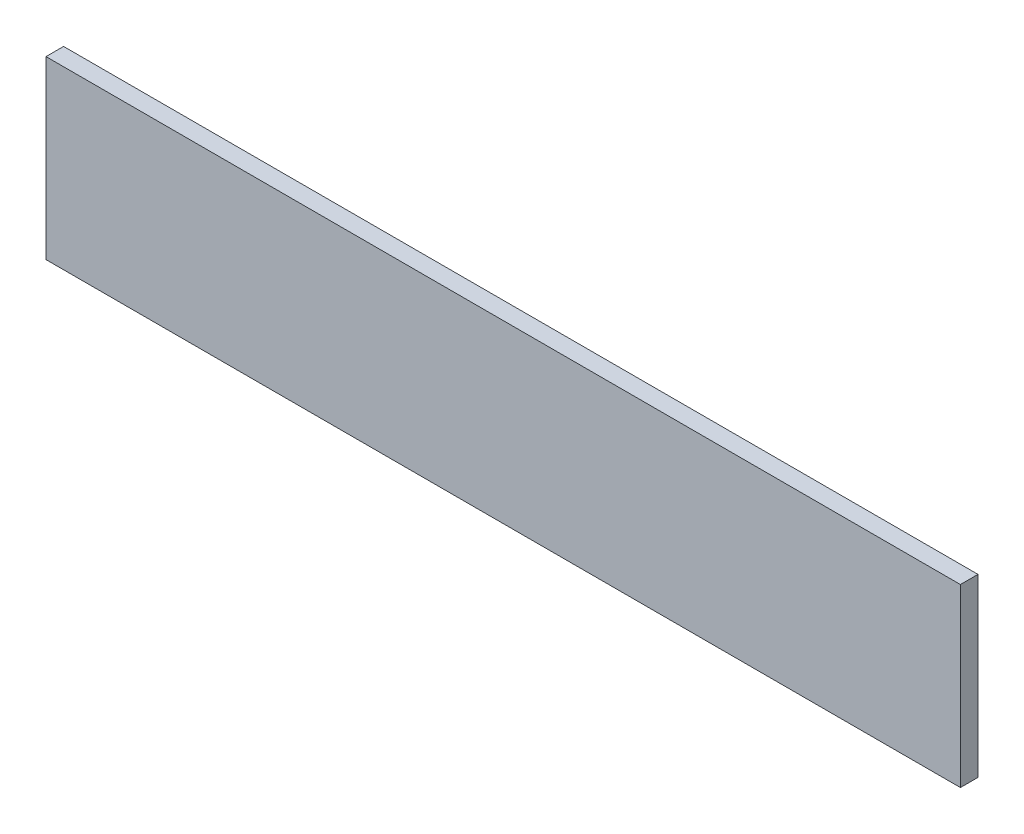
ISO-10303-21;
HEADER;
FILE_DESCRIPTION(('STEP AP214'),'2;1');
FILE_NAME('part.step','',(''),(''),'','','');
FILE_SCHEMA(('AUTOMOTIVE_DESIGN { 1 0 10303 214 1 1 1 1 }'));
ENDSEC;
DATA;
#1=APPLICATION_CONTEXT('core data for automotive mechanical design processes');
#2=APPLICATION_PROTOCOL_DEFINITION('international standard','automotive_design',2000,#1);
#3=PRODUCT_CONTEXT('',#1,'mechanical');
#4=PRODUCT('Part','Part','',(#3));
#5=PRODUCT_RELATED_PRODUCT_CATEGORY('part','',(#4));
#6=PRODUCT_DEFINITION_FORMATION('','',#4);
#7=PRODUCT_DEFINITION_CONTEXT('part definition',#1,'design');
#8=PRODUCT_DEFINITION('design','',#6,#7);
#9=PRODUCT_DEFINITION_SHAPE('','',#8);
#10=(LENGTH_UNIT() NAMED_UNIT(*) SI_UNIT(.MILLI.,.METRE.));
#11=(NAMED_UNIT(*) PLANE_ANGLE_UNIT() SI_UNIT($,.RADIAN.));
#12=(NAMED_UNIT(*) SI_UNIT($,.STERADIAN.) SOLID_ANGLE_UNIT());
#13=UNCERTAINTY_MEASURE_WITH_UNIT(LENGTH_MEASURE(1.E-05),#10,'distance_accuracy_value','');
#14=(GEOMETRIC_REPRESENTATION_CONTEXT(3) GLOBAL_UNCERTAINTY_ASSIGNED_CONTEXT((#13)) GLOBAL_UNIT_ASSIGNED_CONTEXT((#10,
#11,#12)) REPRESENTATION_CONTEXT('',''));
#15=CARTESIAN_POINT('',(0.,0.,0.));
#16=DIRECTION('',(0.,0.,1.));
#17=DIRECTION('',(1.,0.,0.));
#18=AXIS2_PLACEMENT_3D('',#15,#16,#17);
#19=CARTESIAN_POINT('',(0.,0.,5.));
#20=DIRECTION('',(1.,0.,0.));
#21=DIRECTION('',(0.,1.,0.));
#22=AXIS2_PLACEMENT_3D('',#19,#20,#21);
#23=PLANE('',#22);
#24=DIRECTION('',(0.,-1.,0.));
#25=VECTOR('',#24,1.);
#26=CARTESIAN_POINT('',(0.,0.,0.));
#27=LINE('',#26,#25);
#28=CARTESIAN_POINT('',(0.,0.,0.));
#29=VERTEX_POINT('',#28);
#30=CARTESIAN_POINT('',(0.,-50.,0.));
#31=VERTEX_POINT('',#30);
#32=EDGE_CURVE('E96',#29,#31,#27,.T.);
#33=ORIENTED_EDGE('',*,*,#32,.T.);
#34=DIRECTION('',(0.,0.,-1.));
#35=VECTOR('',#34,1.);
#36=CARTESIAN_POINT('',(0.,-50.,5.));
#37=LINE('',#36,#35);
#38=CARTESIAN_POINT('',(0.,-50.,5.));
#39=VERTEX_POINT('',#38);
#40=EDGE_CURVE('E11',#39,#31,#37,.T.);
#41=ORIENTED_EDGE('',*,*,#40,.F.);
#42=DIRECTION('',(0.,-1.,0.));
#43=VECTOR('',#42,1.);
#44=CARTESIAN_POINT('',(0.,0.,5.));
#45=LINE('',#44,#43);
#46=CARTESIAN_POINT('',(0.,0.,5.));
#47=VERTEX_POINT('',#46);
#48=EDGE_CURVE('E84',#47,#39,#45,.T.);
#49=ORIENTED_EDGE('',*,*,#48,.F.);
#50=DIRECTION('',(0.,0.,-1.));
#51=VECTOR('',#50,1.);
#52=CARTESIAN_POINT('',(0.,0.,5.));
#53=LINE('',#52,#51);
#54=EDGE_CURVE('E92',#47,#29,#53,.T.);
#55=ORIENTED_EDGE('',*,*,#54,.T.);
#56=EDGE_LOOP('',(#33,#41,#49,#55));
#57=FACE_BOUND('',#56,.T.);
#58=ADVANCED_FACE('F33',(#57),#23,.F.);
#59=CARTESIAN_POINT('',(0.,-50.,5.));
#60=DIRECTION('',(0.,1.,0.));
#61=DIRECTION('',(0.,0.,1.));
#62=AXIS2_PLACEMENT_3D('',#59,#60,#61);
#63=PLANE('',#62);
#64=DIRECTION('',(1.,0.,0.));
#65=VECTOR('',#64,1.);
#66=CARTESIAN_POINT('',(0.,-50.,0.));
#67=LINE('',#66,#65);
#68=CARTESIAN_POINT('',(260.,-50.,0.));
#69=VERTEX_POINT('',#68);
#70=EDGE_CURVE('E88',#31,#69,#67,.T.);
#71=ORIENTED_EDGE('',*,*,#70,.T.);
#72=DIRECTION('',(0.,0.,-1.));
#73=VECTOR('',#72,1.);
#74=CARTESIAN_POINT('',(260.,-50.,5.));
#75=LINE('',#74,#73);
#76=CARTESIAN_POINT('',(260.,-50.,5.));
#77=VERTEX_POINT('',#76);
#78=EDGE_CURVE('E41',#77,#69,#75,.T.);
#79=ORIENTED_EDGE('',*,*,#78,.F.);
#80=DIRECTION('',(1.,0.,0.));
#81=VECTOR('',#80,1.);
#82=CARTESIAN_POINT('',(0.,-50.,5.));
#83=LINE('',#82,#81);
#84=EDGE_CURVE('E79',#39,#77,#83,.T.);
#85=ORIENTED_EDGE('',*,*,#84,.F.);
#86=ORIENTED_EDGE('',*,*,#40,.T.);
#87=EDGE_LOOP('',(#71,#79,#85,#86));
#88=FACE_BOUND('',#87,.T.);
#89=ADVANCED_FACE('F87',(#88),#63,.F.);
#90=CARTESIAN_POINT('',(260.,0.,5.));
#91=DIRECTION('',(-1.,0.,0.));
#92=DIRECTION('',(0.,0.,1.));
#93=AXIS2_PLACEMENT_3D('',#90,#91,#92);
#94=PLANE('',#93);
#95=DIRECTION('',(0.,1.,0.));
#96=VECTOR('',#95,1.);
#97=CARTESIAN_POINT('',(260.,0.,0.));
#98=LINE('',#97,#96);
#99=CARTESIAN_POINT('',(260.,0.,0.));
#100=VERTEX_POINT('',#99);
#101=EDGE_CURVE('E66',#69,#100,#98,.T.);
#102=ORIENTED_EDGE('',*,*,#101,.T.);
#103=DIRECTION('',(0.,0.,-1.));
#104=VECTOR('',#103,1.);
#105=CARTESIAN_POINT('',(260.,0.,5.));
#106=LINE('',#105,#104);
#107=CARTESIAN_POINT('',(260.,0.,5.));
#108=VERTEX_POINT('',#107);
#109=EDGE_CURVE('E89',#108,#100,#106,.T.);
#110=ORIENTED_EDGE('',*,*,#109,.F.);
#111=DIRECTION('',(0.,1.,0.));
#112=VECTOR('',#111,1.);
#113=CARTESIAN_POINT('',(260.,0.,5.));
#114=LINE('',#113,#112);
#115=EDGE_CURVE('E82',#77,#108,#114,.T.);
#116=ORIENTED_EDGE('',*,*,#115,.F.);
#117=ORIENTED_EDGE('',*,*,#78,.T.);
#118=EDGE_LOOP('',(#102,#110,#116,#117));
#119=FACE_BOUND('',#118,.T.);
#120=ADVANCED_FACE('F90',(#119),#94,.F.);
#121=CARTESIAN_POINT('',(0.,0.,5.));
#122=DIRECTION('',(0.,-1.,0.));
#123=DIRECTION('',(0.,0.,-1.));
#124=AXIS2_PLACEMENT_3D('',#121,#122,#123);
#125=PLANE('',#124);
#126=DIRECTION('',(-1.,0.,0.));
#127=VECTOR('',#126,1.);
#128=CARTESIAN_POINT('',(0.,0.,0.));
#129=LINE('',#128,#127);
#130=EDGE_CURVE('E72',#100,#29,#129,.T.);
#131=ORIENTED_EDGE('',*,*,#130,.T.);
#132=ORIENTED_EDGE('',*,*,#54,.F.);
#133=DIRECTION('',(-1.,0.,0.));
#134=VECTOR('',#133,1.);
#135=CARTESIAN_POINT('',(0.,0.,5.));
#136=LINE('',#135,#134);
#137=EDGE_CURVE('E49',#108,#47,#136,.T.);
#138=ORIENTED_EDGE('',*,*,#137,.F.);
#139=ORIENTED_EDGE('',*,*,#109,.T.);
#140=EDGE_LOOP('',(#131,#132,#138,#139));
#141=FACE_BOUND('',#140,.T.);
#142=ADVANCED_FACE('F103',(#141),#125,.F.);
#143=CARTESIAN_POINT('',(0.,0.,5.));
#144=DIRECTION('',(0.,0.,1.));
#145=DIRECTION('',(1.,0.,0.));
#146=AXIS2_PLACEMENT_3D('',#143,#144,#145);
#147=PLANE('',#146);
#148=ORIENTED_EDGE('',*,*,#48,.T.);
#149=ORIENTED_EDGE('',*,*,#84,.T.);
#150=ORIENTED_EDGE('',*,*,#115,.T.);
#151=ORIENTED_EDGE('',*,*,#137,.T.);
#152=EDGE_LOOP('',(#148,#149,#150,#151));
#153=FACE_BOUND('',#152,.T.);
#154=ADVANCED_FACE('F80',(#153),#147,.T.);
#155=CARTESIAN_POINT('',(0.,0.,0.));
#156=DIRECTION('',(0.,0.,1.));
#157=DIRECTION('',(1.,0.,0.));
#158=AXIS2_PLACEMENT_3D('',#155,#156,#157);
#159=PLANE('',#158);
#160=ORIENTED_EDGE('',*,*,#32,.F.);
#161=ORIENTED_EDGE('',*,*,#130,.F.);
#162=ORIENTED_EDGE('',*,*,#101,.F.);
#163=ORIENTED_EDGE('',*,*,#70,.F.);
#164=EDGE_LOOP('',(#160,#161,#162,#163));
#165=FACE_BOUND('',#164,.T.);
#166=ADVANCED_FACE('F106',(#165),#159,.F.);
#167=CLOSED_SHELL('',(#58,#89,#120,#142,#154,#166));
#168=MANIFOLD_SOLID_BREP('B2',#167);
#169=ADVANCED_BREP_SHAPE_REPRESENTATION('',(#18,#168),#14);
#170=SHAPE_DEFINITION_REPRESENTATION(#9,#169);
ENDSEC;
END-ISO-10303-21;
